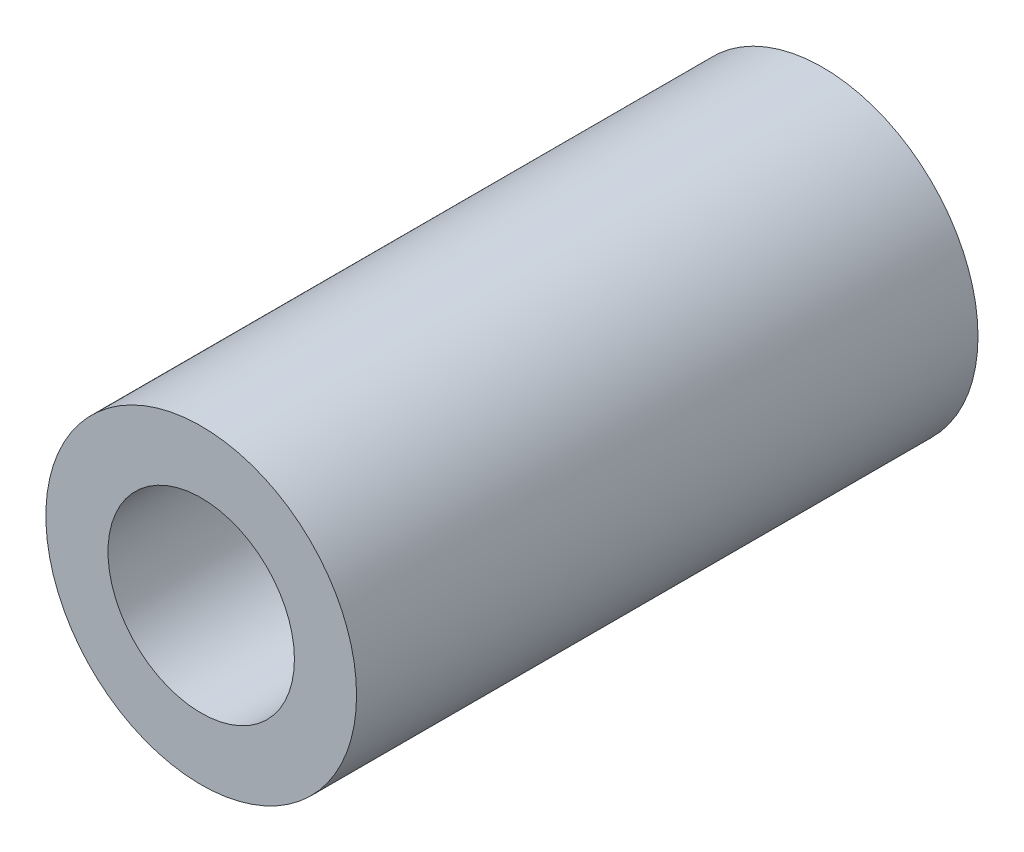
ISO-10303-21;
HEADER;
FILE_DESCRIPTION(('STEP AP214'),'2;1');
FILE_NAME('part.step','',(''),(''),'','','');
FILE_SCHEMA(('AUTOMOTIVE_DESIGN { 1 0 10303 214 1 1 1 1 }'));
ENDSEC;
DATA;
#1=APPLICATION_CONTEXT('core data for automotive mechanical design processes');
#2=APPLICATION_PROTOCOL_DEFINITION('international standard','automotive_design',2000,#1);
#3=PRODUCT_CONTEXT('',#1,'mechanical');
#4=PRODUCT('Part','Part','',(#3));
#5=PRODUCT_RELATED_PRODUCT_CATEGORY('part','',(#4));
#6=PRODUCT_DEFINITION_FORMATION('','',#4);
#7=PRODUCT_DEFINITION_CONTEXT('part definition',#1,'design');
#8=PRODUCT_DEFINITION('design','',#6,#7);
#9=PRODUCT_DEFINITION_SHAPE('','',#8);
#10=(LENGTH_UNIT() NAMED_UNIT(*) SI_UNIT(.MILLI.,.METRE.));
#11=(NAMED_UNIT(*) PLANE_ANGLE_UNIT() SI_UNIT($,.RADIAN.));
#12=(NAMED_UNIT(*) SI_UNIT($,.STERADIAN.) SOLID_ANGLE_UNIT());
#13=UNCERTAINTY_MEASURE_WITH_UNIT(LENGTH_MEASURE(1.E-05),#10,'distance_accuracy_value','');
#14=(GEOMETRIC_REPRESENTATION_CONTEXT(3) GLOBAL_UNCERTAINTY_ASSIGNED_CONTEXT((#13)) GLOBAL_UNIT_ASSIGNED_CONTEXT((#10,
#11,#12)) REPRESENTATION_CONTEXT('',''));
#15=CARTESIAN_POINT('',(0.,0.,0.));
#16=DIRECTION('',(0.,0.,1.));
#17=DIRECTION('',(1.,0.,0.));
#18=AXIS2_PLACEMENT_3D('',#15,#16,#17);
#19=CARTESIAN_POINT('',(0.,0.,10.));
#20=DIRECTION('',(0.,0.,-1.));
#21=DIRECTION('',(-1.,0.,0.));
#22=AXIS2_PLACEMENT_3D('',#19,#20,#21);
#23=CYLINDRICAL_SURFACE('',#22,2.5);
#24=CARTESIAN_POINT('',(0.,0.,10.));
#25=DIRECTION('',(0.,0.,1.));
#26=DIRECTION('',(1.,0.,0.));
#27=AXIS2_PLACEMENT_3D('',#24,#25,#26);
#28=CIRCLE('',#27,2.5);
#29=CARTESIAN_POINT('',(2.5,0.,10.));
#30=VERTEX_POINT('',#29);
#31=EDGE_CURVE('E10',#30,#30,#28,.T.);
#32=ORIENTED_EDGE('',*,*,#31,.F.);
#33=EDGE_LOOP('',(#32));
#34=FACE_BOUND('',#33,.T.);
#35=CARTESIAN_POINT('',(0.,0.,0.));
#36=DIRECTION('',(0.,0.,1.));
#37=DIRECTION('',(1.,0.,0.));
#38=AXIS2_PLACEMENT_3D('',#35,#36,#37);
#39=CIRCLE('',#38,2.5);
#40=CARTESIAN_POINT('',(2.5,0.,0.));
#41=VERTEX_POINT('',#40);
#42=EDGE_CURVE('E44',#41,#41,#39,.T.);
#43=ORIENTED_EDGE('',*,*,#42,.T.);
#44=EDGE_LOOP('',(#43));
#45=FACE_BOUND('',#44,.T.);
#46=ADVANCED_FACE('F41',(#34,#45),#23,.T.);
#47=CARTESIAN_POINT('',(0.,0.,10.));
#48=DIRECTION('',(0.,0.,1.));
#49=DIRECTION('',(1.,0.,0.));
#50=AXIS2_PLACEMENT_3D('',#47,#48,#49);
#51=PLANE('',#50);
#52=CARTESIAN_POINT('',(0.,0.,10.));
#53=DIRECTION('',(0.,0.,1.));
#54=DIRECTION('',(1.,0.,0.));
#55=AXIS2_PLACEMENT_3D('',#52,#53,#54);
#56=CIRCLE('',#55,1.5);
#57=CARTESIAN_POINT('',(1.5,0.,10.));
#58=VERTEX_POINT('',#57);
#59=EDGE_CURVE('E55',#58,#58,#56,.T.);
#60=ORIENTED_EDGE('',*,*,#59,.F.);
#61=EDGE_LOOP('',(#60));
#62=FACE_BOUND('',#61,.T.);
#63=ORIENTED_EDGE('',*,*,#31,.T.);
#64=EDGE_LOOP('',(#63));
#65=FACE_BOUND('',#64,.T.);
#66=ADVANCED_FACE('F72',(#62,#65),#51,.T.);
#67=CARTESIAN_POINT('',(0.,0.,0.));
#68=DIRECTION('',(0.,0.,1.));
#69=DIRECTION('',(1.,0.,0.));
#70=AXIS2_PLACEMENT_3D('',#67,#68,#69);
#71=PLANE('',#70);
#72=CARTESIAN_POINT('',(0.,0.,0.));
#73=DIRECTION('',(0.,0.,1.));
#74=DIRECTION('',(1.,0.,0.));
#75=AXIS2_PLACEMENT_3D('',#72,#73,#74);
#76=CIRCLE('',#75,1.5);
#77=CARTESIAN_POINT('',(1.5,0.,0.));
#78=VERTEX_POINT('',#77);
#79=EDGE_CURVE('E53',#78,#78,#76,.T.);
#80=ORIENTED_EDGE('',*,*,#79,.T.);
#81=EDGE_LOOP('',(#80));
#82=FACE_BOUND('',#81,.T.);
#83=ORIENTED_EDGE('',*,*,#42,.F.);
#84=EDGE_LOOP('',(#83));
#85=FACE_BOUND('',#84,.T.);
#86=ADVANCED_FACE('F63',(#82,#85),#71,.F.);
#87=CARTESIAN_POINT('',(0.,0.,0.));
#88=DIRECTION('',(0.,0.,1.));
#89=DIRECTION('',(1.,0.,0.));
#90=AXIS2_PLACEMENT_3D('',#87,#88,#89);
#91=CYLINDRICAL_SURFACE('',#90,1.5);
#92=ORIENTED_EDGE('',*,*,#79,.F.);
#93=EDGE_LOOP('',(#92));
#94=FACE_BOUND('',#93,.T.);
#95=ORIENTED_EDGE('',*,*,#59,.T.);
#96=EDGE_LOOP('',(#95));
#97=FACE_BOUND('',#96,.T.);
#98=ADVANCED_FACE('F66',(#94,#97),#91,.F.);
#99=CLOSED_SHELL('',(#46,#66,#86,#98));
#100=MANIFOLD_SOLID_BREP('B2',#99);
#101=ADVANCED_BREP_SHAPE_REPRESENTATION('',(#18,#100),#14);
#102=SHAPE_DEFINITION_REPRESENTATION(#9,#101);
ENDSEC;
END-ISO-10303-21;
